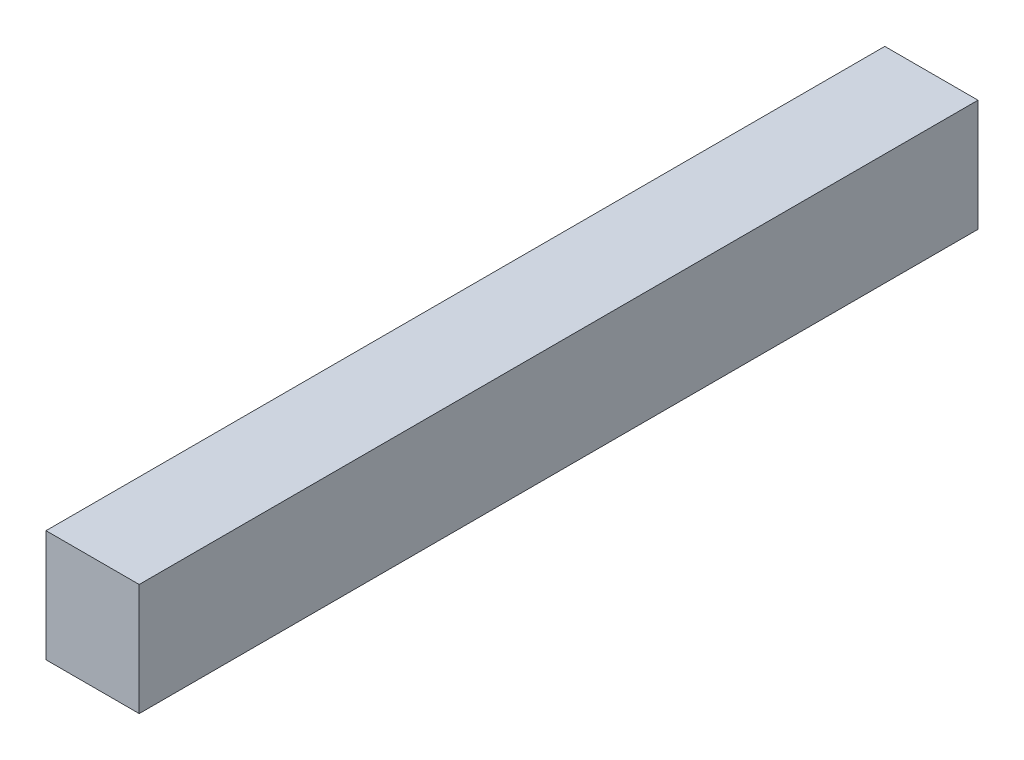
ISO-10303-21;
HEADER;
FILE_DESCRIPTION(('STEP AP214'),'2;1');
FILE_NAME('part.step','',(''),(''),'','','');
FILE_SCHEMA(('AUTOMOTIVE_DESIGN { 1 0 10303 214 1 1 1 1 }'));
ENDSEC;
DATA;
#1=APPLICATION_CONTEXT('core data for automotive mechanical design processes');
#2=APPLICATION_PROTOCOL_DEFINITION('international standard','automotive_design',2000,#1);
#3=PRODUCT_CONTEXT('',#1,'mechanical');
#4=PRODUCT('Part','Part','',(#3));
#5=PRODUCT_RELATED_PRODUCT_CATEGORY('part','',(#4));
#6=PRODUCT_DEFINITION_FORMATION('','',#4);
#7=PRODUCT_DEFINITION_CONTEXT('part definition',#1,'design');
#8=PRODUCT_DEFINITION('design','',#6,#7);
#9=PRODUCT_DEFINITION_SHAPE('','',#8);
#10=(LENGTH_UNIT() NAMED_UNIT(*) SI_UNIT(.MILLI.,.METRE.));
#11=(NAMED_UNIT(*) PLANE_ANGLE_UNIT() SI_UNIT($,.RADIAN.));
#12=(NAMED_UNIT(*) SI_UNIT($,.STERADIAN.) SOLID_ANGLE_UNIT());
#13=UNCERTAINTY_MEASURE_WITH_UNIT(LENGTH_MEASURE(1.E-05),#10,'distance_accuracy_value','');
#14=(GEOMETRIC_REPRESENTATION_CONTEXT(3) GLOBAL_UNCERTAINTY_ASSIGNED_CONTEXT((#13)) GLOBAL_UNIT_ASSIGNED_CONTEXT((#10,
#11,#12)) REPRESENTATION_CONTEXT('',''));
#15=CARTESIAN_POINT('',(0.,0.,0.));
#16=DIRECTION('',(0.,0.,1.));
#17=DIRECTION('',(1.,0.,0.));
#18=AXIS2_PLACEMENT_3D('',#15,#16,#17);
#19=CARTESIAN_POINT('',(12.5,-30.,112.5));
#20=DIRECTION('',(1.,0.,0.));
#21=DIRECTION('',(0.,0.,-1.));
#22=AXIS2_PLACEMENT_3D('',#19,#20,#21);
#23=PLANE('',#22);
#24=DIRECTION('',(0.,0.,-1.));
#25=VECTOR('',#24,1.);
#26=CARTESIAN_POINT('',(12.5,0.,112.5));
#27=LINE('',#26,#25);
#28=CARTESIAN_POINT('',(12.5,0.,112.5));
#29=VERTEX_POINT('',#28);
#30=CARTESIAN_POINT('',(12.5,0.,-112.5));
#31=VERTEX_POINT('',#30);
#32=EDGE_CURVE('E105',#29,#31,#27,.T.);
#33=ORIENTED_EDGE('',*,*,#32,.F.);
#34=DIRECTION('',(0.,1.,0.));
#35=VECTOR('',#34,1.);
#36=CARTESIAN_POINT('',(12.5,-30.,112.5));
#37=LINE('',#36,#35);
#38=CARTESIAN_POINT('',(12.5,-30.,112.5));
#39=VERTEX_POINT('',#38);
#40=EDGE_CURVE('E11',#39,#29,#37,.T.);
#41=ORIENTED_EDGE('',*,*,#40,.F.);
#42=DIRECTION('',(0.,0.,-1.));
#43=VECTOR('',#42,1.);
#44=CARTESIAN_POINT('',(12.5,-30.,112.5));
#45=LINE('',#44,#43);
#46=CARTESIAN_POINT('',(12.5,-30.,-112.5));
#47=VERTEX_POINT('',#46);
#48=EDGE_CURVE('E99',#39,#47,#45,.T.);
#49=ORIENTED_EDGE('',*,*,#48,.T.);
#50=DIRECTION('',(0.,1.,0.));
#51=VECTOR('',#50,1.);
#52=CARTESIAN_POINT('',(12.5,-30.,-112.5));
#53=LINE('',#52,#51);
#54=EDGE_CURVE('E44',#47,#31,#53,.T.);
#55=ORIENTED_EDGE('',*,*,#54,.T.);
#56=EDGE_LOOP('',(#33,#41,#49,#55));
#57=FACE_BOUND('',#56,.T.);
#58=ADVANCED_FACE('F41',(#57),#23,.T.);
#59=CARTESIAN_POINT('',(-12.5,-30.,112.5));
#60=DIRECTION('',(0.,0.,1.));
#61=DIRECTION('',(1.,0.,0.));
#62=AXIS2_PLACEMENT_3D('',#59,#60,#61);
#63=PLANE('',#62);
#64=DIRECTION('',(1.,0.,0.));
#65=VECTOR('',#64,1.);
#66=CARTESIAN_POINT('',(-12.5,0.,112.5));
#67=LINE('',#66,#65);
#68=CARTESIAN_POINT('',(-12.5,0.,112.5));
#69=VERTEX_POINT('',#68);
#70=EDGE_CURVE('E101',#69,#29,#67,.T.);
#71=ORIENTED_EDGE('',*,*,#70,.F.);
#72=DIRECTION('',(0.,1.,0.));
#73=VECTOR('',#72,1.);
#74=CARTESIAN_POINT('',(-12.5,-30.,112.5));
#75=LINE('',#74,#73);
#76=CARTESIAN_POINT('',(-12.5,-30.,112.5));
#77=VERTEX_POINT('',#76);
#78=EDGE_CURVE('E50',#77,#69,#75,.T.);
#79=ORIENTED_EDGE('',*,*,#78,.F.);
#80=DIRECTION('',(1.,0.,0.));
#81=VECTOR('',#80,1.);
#82=CARTESIAN_POINT('',(-12.5,-30.,112.5));
#83=LINE('',#82,#81);
#84=EDGE_CURVE('E96',#77,#39,#83,.T.);
#85=ORIENTED_EDGE('',*,*,#84,.T.);
#86=ORIENTED_EDGE('',*,*,#40,.T.);
#87=EDGE_LOOP('',(#71,#79,#85,#86));
#88=FACE_BOUND('',#87,.T.);
#89=ADVANCED_FACE('F115',(#88),#63,.T.);
#90=CARTESIAN_POINT('',(-12.5,-30.,112.5));
#91=DIRECTION('',(-1.,0.,0.));
#92=DIRECTION('',(0.,0.,1.));
#93=AXIS2_PLACEMENT_3D('',#90,#91,#92);
#94=PLANE('',#93);
#95=DIRECTION('',(0.,0.,1.));
#96=VECTOR('',#95,1.);
#97=CARTESIAN_POINT('',(-12.5,0.,112.5));
#98=LINE('',#97,#96);
#99=CARTESIAN_POINT('',(-12.5,0.,-112.5));
#100=VERTEX_POINT('',#99);
#101=EDGE_CURVE('E91',#100,#69,#98,.T.);
#102=ORIENTED_EDGE('',*,*,#101,.F.);
#103=DIRECTION('',(0.,1.,0.));
#104=VECTOR('',#103,1.);
#105=CARTESIAN_POINT('',(-12.5,-30.,-112.5));
#106=LINE('',#105,#104);
#107=CARTESIAN_POINT('',(-12.5,-30.,-112.5));
#108=VERTEX_POINT('',#107);
#109=EDGE_CURVE('E86',#108,#100,#106,.T.);
#110=ORIENTED_EDGE('',*,*,#109,.F.);
#111=DIRECTION('',(0.,0.,1.));
#112=VECTOR('',#111,1.);
#113=CARTESIAN_POINT('',(-12.5,-30.,112.5));
#114=LINE('',#113,#112);
#115=EDGE_CURVE('E89',#108,#77,#114,.T.);
#116=ORIENTED_EDGE('',*,*,#115,.T.);
#117=ORIENTED_EDGE('',*,*,#78,.T.);
#118=EDGE_LOOP('',(#102,#110,#116,#117));
#119=FACE_BOUND('',#118,.T.);
#120=ADVANCED_FACE('F88',(#119),#94,.T.);
#121=CARTESIAN_POINT('',(-12.5,-30.,-112.5));
#122=DIRECTION('',(0.,0.,-1.));
#123=DIRECTION('',(-1.,0.,0.));
#124=AXIS2_PLACEMENT_3D('',#121,#122,#123);
#125=PLANE('',#124);
#126=DIRECTION('',(-1.,0.,0.));
#127=VECTOR('',#126,1.);
#128=CARTESIAN_POINT('',(-12.5,0.,-112.5));
#129=LINE('',#128,#127);
#130=EDGE_CURVE('E108',#31,#100,#129,.T.);
#131=ORIENTED_EDGE('',*,*,#130,.F.);
#132=ORIENTED_EDGE('',*,*,#54,.F.);
#133=DIRECTION('',(-1.,0.,0.));
#134=VECTOR('',#133,1.);
#135=CARTESIAN_POINT('',(-12.5,-30.,-112.5));
#136=LINE('',#135,#134);
#137=EDGE_CURVE('E95',#47,#108,#136,.T.);
#138=ORIENTED_EDGE('',*,*,#137,.T.);
#139=ORIENTED_EDGE('',*,*,#109,.T.);
#140=EDGE_LOOP('',(#131,#132,#138,#139));
#141=FACE_BOUND('',#140,.T.);
#142=ADVANCED_FACE('F98',(#141),#125,.T.);
#143=CARTESIAN_POINT('',(0.,-30.,0.));
#144=DIRECTION('',(0.,-1.,0.));
#145=DIRECTION('',(0.,0.,-1.));
#146=AXIS2_PLACEMENT_3D('',#143,#144,#145);
#147=PLANE('',#146);
#148=ORIENTED_EDGE('',*,*,#48,.F.);
#149=ORIENTED_EDGE('',*,*,#84,.F.);
#150=ORIENTED_EDGE('',*,*,#115,.F.);
#151=ORIENTED_EDGE('',*,*,#137,.F.);
#152=EDGE_LOOP('',(#148,#149,#150,#151));
#153=FACE_BOUND('',#152,.T.);
#154=ADVANCED_FACE('F94',(#153),#147,.T.);
#155=CARTESIAN_POINT('',(0.,0.,0.));
#156=DIRECTION('',(0.,-1.,0.));
#157=DIRECTION('',(0.,0.,-1.));
#158=AXIS2_PLACEMENT_3D('',#155,#156,#157);
#159=PLANE('',#158);
#160=ORIENTED_EDGE('',*,*,#32,.T.);
#161=ORIENTED_EDGE('',*,*,#130,.T.);
#162=ORIENTED_EDGE('',*,*,#101,.T.);
#163=ORIENTED_EDGE('',*,*,#70,.T.);
#164=EDGE_LOOP('',(#160,#161,#162,#163));
#165=FACE_BOUND('',#164,.T.);
#166=ADVANCED_FACE('F114',(#165),#159,.F.);
#167=CLOSED_SHELL('',(#58,#89,#120,#142,#154,#166));
#168=MANIFOLD_SOLID_BREP('B2',#167);
#169=ADVANCED_BREP_SHAPE_REPRESENTATION('',(#18,#168),#14);
#170=SHAPE_DEFINITION_REPRESENTATION(#9,#169);
ENDSEC;
END-ISO-10303-21;
